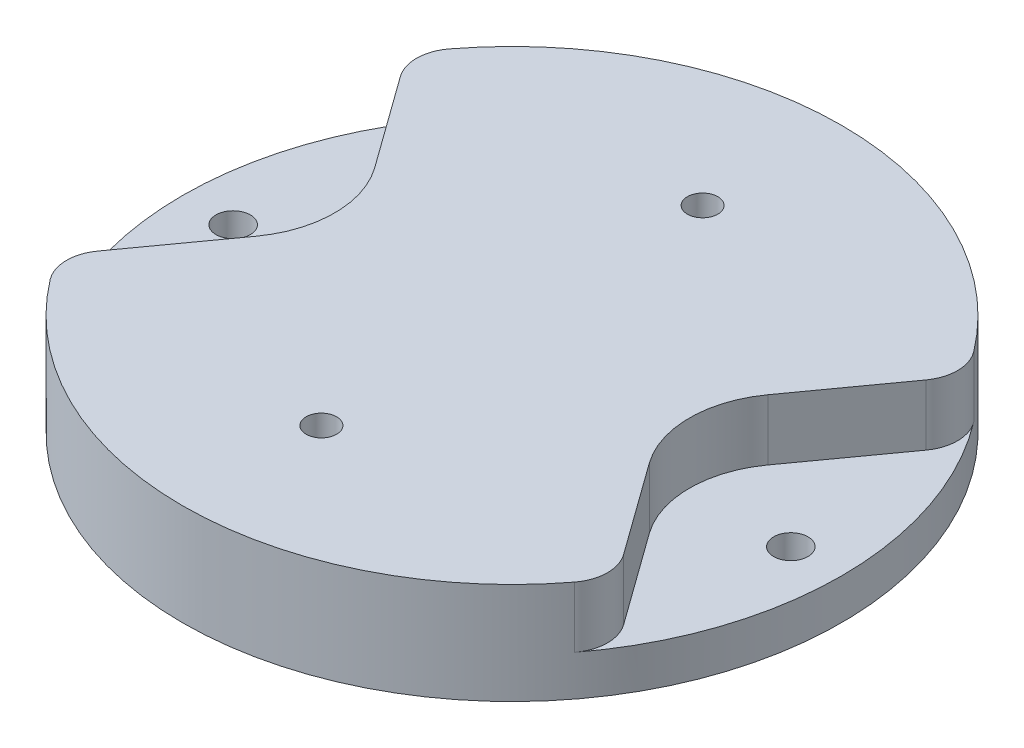
ISO-10303-21;
HEADER;
FILE_DESCRIPTION(('STEP AP214'),'2;1');
FILE_NAME('part.step','',(''),(''),'','','');
FILE_SCHEMA(('AUTOMOTIVE_DESIGN { 1 0 10303 214 1 1 1 1 }'));
ENDSEC;
DATA;
#1=APPLICATION_CONTEXT('core data for automotive mechanical design processes');
#2=APPLICATION_PROTOCOL_DEFINITION('international standard','automotive_design',2000,#1);
#3=PRODUCT_CONTEXT('',#1,'mechanical');
#4=PRODUCT('Part','Part','',(#3));
#5=PRODUCT_RELATED_PRODUCT_CATEGORY('part','',(#4));
#6=PRODUCT_DEFINITION_FORMATION('','',#4);
#7=PRODUCT_DEFINITION_CONTEXT('part definition',#1,'design');
#8=PRODUCT_DEFINITION('design','',#6,#7);
#9=PRODUCT_DEFINITION_SHAPE('','',#8);
#10=(LENGTH_UNIT() NAMED_UNIT(*) SI_UNIT(.MILLI.,.METRE.));
#11=(NAMED_UNIT(*) PLANE_ANGLE_UNIT() SI_UNIT($,.RADIAN.));
#12=(NAMED_UNIT(*) SI_UNIT($,.STERADIAN.) SOLID_ANGLE_UNIT());
#13=UNCERTAINTY_MEASURE_WITH_UNIT(LENGTH_MEASURE(1.E-05),#10,'distance_accuracy_value','');
#14=(GEOMETRIC_REPRESENTATION_CONTEXT(3) GLOBAL_UNCERTAINTY_ASSIGNED_CONTEXT((#13)) GLOBAL_UNIT_ASSIGNED_CONTEXT((#10,
#11,#12)) REPRESENTATION_CONTEXT('',''));
#15=CARTESIAN_POINT('',(0.,0.,0.));
#16=DIRECTION('',(0.,0.,1.));
#17=DIRECTION('',(1.,0.,0.));
#18=AXIS2_PLACEMENT_3D('',#15,#16,#17);
#19=CARTESIAN_POINT('',(0.,12.7,0.));
#20=DIRECTION('',(0.,-1.,0.));
#21=DIRECTION('',(0.,0.,-1.));
#22=AXIS2_PLACEMENT_3D('',#19,#20,#21);
#23=CYLINDRICAL_SURFACE('',#22,41.275);
#24=CARTESIAN_POINT('',(0.,0.,0.));
#25=DIRECTION('',(0.,1.,0.));
#26=DIRECTION('',(0.,0.,1.));
#27=AXIS2_PLACEMENT_3D('',#24,#25,#26);
#28=CIRCLE('',#27,41.275);
#29=CARTESIAN_POINT('',(0.,0.,41.275));
#30=VERTEX_POINT('',#29);
#31=EDGE_CURVE('E282',#30,#30,#28,.T.);
#32=ORIENTED_EDGE('',*,*,#31,.T.);
#33=EDGE_LOOP('',(#32));
#34=FACE_BOUND('',#33,.T.);
#35=CARTESIAN_POINT('',(0.,5.08,0.));
#36=DIRECTION('',(0.,1.,0.));
#37=DIRECTION('',(0.,0.,1.));
#38=AXIS2_PLACEMENT_3D('',#35,#36,#37);
#39=CIRCLE('',#38,41.275);
#40=CARTESIAN_POINT('',(32.8472122737896,5.08,24.9937246292066));
#41=VERTEX_POINT('',#40);
#42=CARTESIAN_POINT('',(32.8472122737896,5.08,-24.9937246292066));
#43=VERTEX_POINT('',#42);
#44=EDGE_CURVE('E202',#41,#43,#39,.T.);
#45=ORIENTED_EDGE('',*,*,#44,.F.);
#46=DIRECTION('',(0.,-1.,0.));
#47=VECTOR('',#46,1.);
#48=CARTESIAN_POINT('',(32.8472122737896,12.7,24.9937246292066));
#49=LINE('',#48,#47);
#50=CARTESIAN_POINT('',(32.8472122737896,12.7,24.9937246292066));
#51=VERTEX_POINT('',#50);
#52=EDGE_CURVE('E328',#41,#51,#49,.F.);
#53=ORIENTED_EDGE('',*,*,#52,.T.);
#54=CARTESIAN_POINT('',(0.,12.7,0.));
#55=DIRECTION('',(0.,1.,0.));
#56=DIRECTION('',(0.,0.,1.));
#57=AXIS2_PLACEMENT_3D('',#54,#55,#56);
#58=CIRCLE('',#57,41.275);
#59=CARTESIAN_POINT('',(-32.8472122737896,12.7,24.9937246292066));
#60=VERTEX_POINT('',#59);
#61=EDGE_CURVE('E301',#60,#51,#58,.T.);
#62=ORIENTED_EDGE('',*,*,#61,.F.);
#63=DIRECTION('',(0.,-1.,0.));
#64=VECTOR('',#63,1.);
#65=CARTESIAN_POINT('',(-32.8472122737896,12.7,24.9937246292066));
#66=LINE('',#65,#64);
#67=CARTESIAN_POINT('',(-32.8472122737896,5.08,24.9937246292066));
#68=VERTEX_POINT('',#67);
#69=EDGE_CURVE('E320',#60,#68,#66,.T.);
#70=ORIENTED_EDGE('',*,*,#69,.T.);
#71=CARTESIAN_POINT('',(0.,5.08,0.));
#72=DIRECTION('',(0.,1.,0.));
#73=DIRECTION('',(0.,0.,1.));
#74=AXIS2_PLACEMENT_3D('',#71,#72,#73);
#75=CIRCLE('',#74,41.275);
#76=CARTESIAN_POINT('',(-32.8472122737896,5.08,-24.9937246292066));
#77=VERTEX_POINT('',#76);
#78=EDGE_CURVE('E252',#77,#68,#75,.T.);
#79=ORIENTED_EDGE('',*,*,#78,.F.);
#80=DIRECTION('',(0.,-1.,0.));
#81=VECTOR('',#80,1.);
#82=CARTESIAN_POINT('',(-32.8472122737896,12.7,-24.9937246292066));
#83=LINE('',#82,#81);
#84=CARTESIAN_POINT('',(-32.8472122737896,12.7,-24.9937246292066));
#85=VERTEX_POINT('',#84);
#86=EDGE_CURVE('E300',#77,#85,#83,.F.);
#87=ORIENTED_EDGE('',*,*,#86,.T.);
#88=CARTESIAN_POINT('',(32.8472122737896,12.7,-24.9937246292066));
#89=VERTEX_POINT('',#88);
#90=EDGE_CURVE('E296',#89,#85,#58,.T.);
#91=ORIENTED_EDGE('',*,*,#90,.F.);
#92=DIRECTION('',(0.,-1.,0.));
#93=VECTOR('',#92,1.);
#94=CARTESIAN_POINT('',(32.8472122737896,12.7,-24.9937246292066));
#95=LINE('',#94,#93);
#96=EDGE_CURVE('E324',#89,#43,#95,.T.);
#97=ORIENTED_EDGE('',*,*,#96,.T.);
#98=EDGE_LOOP('',(#45,#53,#62,#70,#79,#87,#91,#97));
#99=FACE_BOUND('',#98,.T.);
#100=ADVANCED_FACE('F99',(#34,#99),#23,.T.);
#101=CARTESIAN_POINT('',(-34.925,12.7,0.));
#102=DIRECTION('',(0.,-1.,0.));
#103=DIRECTION('',(0.,0.,-1.));
#104=AXIS2_PLACEMENT_3D('',#101,#102,#103);
#105=CYLINDRICAL_SURFACE('',#104,2.15);
#106=CARTESIAN_POINT('',(-34.925,0.,0.));
#107=DIRECTION('',(0.,1.,0.));
#108=DIRECTION('',(0.,0.,1.));
#109=AXIS2_PLACEMENT_3D('',#106,#107,#108);
#110=CIRCLE('',#109,2.15);
#111=CARTESIAN_POINT('',(-34.925,0.,2.15));
#112=VERTEX_POINT('',#111);
#113=EDGE_CURVE('E291',#112,#112,#110,.T.);
#114=ORIENTED_EDGE('',*,*,#113,.F.);
#115=EDGE_LOOP('',(#114));
#116=FACE_BOUND('',#115,.T.);
#117=CARTESIAN_POINT('',(-34.925,5.08,0.));
#118=DIRECTION('',(0.,1.,0.));
#119=DIRECTION('',(0.,0.,1.));
#120=AXIS2_PLACEMENT_3D('',#117,#118,#119);
#121=CIRCLE('',#120,2.15);
#122=CARTESIAN_POINT('',(-34.925,5.08,2.15));
#123=VERTEX_POINT('',#122);
#124=EDGE_CURVE('E277',#123,#123,#121,.T.);
#125=ORIENTED_EDGE('',*,*,#124,.T.);
#126=EDGE_LOOP('',(#125));
#127=FACE_BOUND('',#126,.T.);
#128=ADVANCED_FACE('F414',(#116,#127),#105,.F.);
#129=CARTESIAN_POINT('',(34.925,12.7,0.));
#130=DIRECTION('',(0.,-1.,0.));
#131=DIRECTION('',(0.,0.,-1.));
#132=AXIS2_PLACEMENT_3D('',#129,#130,#131);
#133=CYLINDRICAL_SURFACE('',#132,2.15);
#134=CARTESIAN_POINT('',(34.925,0.,0.));
#135=DIRECTION('',(0.,1.,0.));
#136=DIRECTION('',(0.,0.,1.));
#137=AXIS2_PLACEMENT_3D('',#134,#135,#136);
#138=CIRCLE('',#137,2.15);
#139=CARTESIAN_POINT('',(34.925,0.,2.14999999999999));
#140=VERTEX_POINT('',#139);
#141=EDGE_CURVE('E283',#140,#140,#138,.T.);
#142=ORIENTED_EDGE('',*,*,#141,.F.);
#143=EDGE_LOOP('',(#142));
#144=FACE_BOUND('',#143,.T.);
#145=CARTESIAN_POINT('',(34.925,5.08,0.));
#146=DIRECTION('',(0.,1.,0.));
#147=DIRECTION('',(0.,0.,1.));
#148=AXIS2_PLACEMENT_3D('',#145,#146,#147);
#149=CIRCLE('',#148,2.15);
#150=CARTESIAN_POINT('',(34.925,5.08,2.14999999999999));
#151=VERTEX_POINT('',#150);
#152=EDGE_CURVE('E213',#151,#151,#149,.T.);
#153=ORIENTED_EDGE('',*,*,#152,.T.);
#154=EDGE_LOOP('',(#153));
#155=FACE_BOUND('',#154,.T.);
#156=ADVANCED_FACE('F420',(#144,#155),#133,.F.);
#157=CARTESIAN_POINT('',(0.,12.7,0.));
#158=DIRECTION('',(0.,1.,0.));
#159=DIRECTION('',(0.,0.,1.));
#160=AXIS2_PLACEMENT_3D('',#157,#158,#159);
#161=PLANE('',#160);
#162=ORIENTED_EDGE('',*,*,#61,.T.);
#163=CARTESIAN_POINT('',(28.804478455477,12.7,21.9175739056119));
#164=DIRECTION('',(0.,1.,0.));
#165=DIRECTION('',(0.,0.,1.));
#166=AXIS2_PLACEMENT_3D('',#163,#164,#165);
#167=CIRCLE('',#166,5.08);
#168=CARTESIAN_POINT('',(32.9257259832032,12.7,18.9474360611322));
#169=VERTEX_POINT('',#168);
#170=EDGE_CURVE('E341',#51,#169,#167,.T.);
#171=ORIENTED_EDGE('',*,*,#170,.T.);
#172=DIRECTION('',(-0.584672804031446,0.,-0.811269198371297));
#173=VECTOR('',#172,1.);
#174=CARTESIAN_POINT('',(12.6830392801778,12.7,-9.14052715728607));
#175=LINE('',#174,#173);
#176=CARTESIAN_POINT('',(24.6218811806846,12.7,7.42534461119937));
#177=VERTEX_POINT('',#176);
#178=EDGE_CURVE('E219',#169,#177,#175,.T.);
#179=ORIENTED_EDGE('',*,*,#178,.T.);
#180=CARTESIAN_POINT('',(34.925,12.7,0.));
#181=DIRECTION('',(0.,1.,0.));
#182=DIRECTION('',(0.,0.,1.));
#183=AXIS2_PLACEMENT_3D('',#180,#181,#182);
#184=CIRCLE('',#183,12.7);
#185=CARTESIAN_POINT('',(24.6218811806845,12.7,-7.42534461119939));
#186=VERTEX_POINT('',#185);
#187=EDGE_CURVE('E220',#186,#177,#184,.T.);
#188=ORIENTED_EDGE('',*,*,#187,.F.);
#189=DIRECTION('',(-0.584672804031447,0.,0.811269198371296));
#190=VECTOR('',#189,1.);
#191=CARTESIAN_POINT('',(12.6830392801778,12.7,9.14052715728607));
#192=LINE('',#191,#190);
#193=CARTESIAN_POINT('',(32.9257259832032,12.7,-18.9474360611322));
#194=VERTEX_POINT('',#193);
#195=EDGE_CURVE('E203',#194,#186,#192,.T.);
#196=ORIENTED_EDGE('',*,*,#195,.F.);
#197=CARTESIAN_POINT('',(28.804478455477,12.7,-21.9175739056119));
#198=DIRECTION('',(0.,1.,0.));
#199=DIRECTION('',(0.,0.,1.));
#200=AXIS2_PLACEMENT_3D('',#197,#198,#199);
#201=CIRCLE('',#200,5.08);
#202=EDGE_CURVE('E338',#194,#89,#201,.T.);
#203=ORIENTED_EDGE('',*,*,#202,.T.);
#204=ORIENTED_EDGE('',*,*,#90,.T.);
#205=CARTESIAN_POINT('',(-28.804478455477,12.7,-21.9175739056119));
#206=DIRECTION('',(0.,1.,0.));
#207=DIRECTION('',(0.,0.,1.));
#208=AXIS2_PLACEMENT_3D('',#205,#206,#207);
#209=CIRCLE('',#208,5.08);
#210=CARTESIAN_POINT('',(-32.9257259832032,12.7,-18.9474360611322));
#211=VERTEX_POINT('',#210);
#212=EDGE_CURVE('E332',#85,#211,#209,.T.);
#213=ORIENTED_EDGE('',*,*,#212,.T.);
#214=DIRECTION('',(0.584672804031447,0.,0.811269198371296));
#215=VECTOR('',#214,1.);
#216=CARTESIAN_POINT('',(-12.6830392801778,12.7,9.14052715728606));
#217=LINE('',#216,#215);
#218=CARTESIAN_POINT('',(-24.6218811806845,12.7,-7.42534461119938));
#219=VERTEX_POINT('',#218);
#220=EDGE_CURVE('E237',#211,#219,#217,.T.);
#221=ORIENTED_EDGE('',*,*,#220,.T.);
#222=CARTESIAN_POINT('',(-34.925,12.7,0.));
#223=DIRECTION('',(0.,1.,0.));
#224=DIRECTION('',(0.,0.,1.));
#225=AXIS2_PLACEMENT_3D('',#222,#223,#224);
#226=CIRCLE('',#225,12.7);
#227=CARTESIAN_POINT('',(-24.6218811806845,12.7,7.42534461119936));
#228=VERTEX_POINT('',#227);
#229=EDGE_CURVE('E226',#228,#219,#226,.T.);
#230=ORIENTED_EDGE('',*,*,#229,.F.);
#231=DIRECTION('',(0.584672804031446,0.,-0.811269198371297));
#232=VECTOR('',#231,1.);
#233=CARTESIAN_POINT('',(-12.6830392801778,12.7,-9.14052715728606));
#234=LINE('',#233,#232);
#235=CARTESIAN_POINT('',(-32.9257259832032,12.7,18.9474360611322));
#236=VERTEX_POINT('',#235);
#237=EDGE_CURVE('E243',#236,#228,#234,.T.);
#238=ORIENTED_EDGE('',*,*,#237,.F.);
#239=CARTESIAN_POINT('',(-28.804478455477,12.7,21.9175739056119));
#240=DIRECTION('',(0.,1.,0.));
#241=DIRECTION('',(0.,0.,1.));
#242=AXIS2_PLACEMENT_3D('',#239,#240,#241);
#243=CIRCLE('',#242,5.08);
#244=EDGE_CURVE('E335',#236,#60,#243,.T.);
#245=ORIENTED_EDGE('',*,*,#244,.T.);
#246=EDGE_LOOP('',(#162,#171,#179,#188,#196,#203,#204,#213,#221,#230,#238,#245));
#247=FACE_BOUND('',#246,.T.);
#248=CARTESIAN_POINT('',(0.,12.7,-23.876));
#249=DIRECTION('',(0.,1.,0.));
#250=DIRECTION('',(0.,0.,1.));
#251=AXIS2_PLACEMENT_3D('',#248,#249,#250);
#252=CIRCLE('',#251,1.905);
#253=CARTESIAN_POINT('',(0.,12.7,-21.971));
#254=VERTEX_POINT('',#253);
#255=EDGE_CURVE('E278',#254,#254,#252,.T.);
#256=ORIENTED_EDGE('',*,*,#255,.F.);
#257=EDGE_LOOP('',(#256));
#258=FACE_BOUND('',#257,.T.);
#259=CARTESIAN_POINT('',(0.,12.7,23.876));
#260=DIRECTION('',(0.,1.,0.));
#261=DIRECTION('',(0.,0.,1.));
#262=AXIS2_PLACEMENT_3D('',#259,#260,#261);
#263=CIRCLE('',#262,1.905);
#264=CARTESIAN_POINT('',(0.,12.7,25.781));
#265=VERTEX_POINT('',#264);
#266=EDGE_CURVE('E287',#265,#265,#263,.T.);
#267=ORIENTED_EDGE('',*,*,#266,.F.);
#268=EDGE_LOOP('',(#267));
#269=FACE_BOUND('',#268,.T.);
#270=ADVANCED_FACE('F383',(#247,#258,#269),#161,.T.);
#271=CARTESIAN_POINT('',(0.,0.,0.));
#272=DIRECTION('',(0.,1.,0.));
#273=DIRECTION('',(0.,0.,1.));
#274=AXIS2_PLACEMENT_3D('',#271,#272,#273);
#275=PLANE('',#274);
#276=CARTESIAN_POINT('',(0.,0.,-23.876));
#277=DIRECTION('',(0.,1.,0.));
#278=DIRECTION('',(0.,0.,1.));
#279=AXIS2_PLACEMENT_3D('',#276,#277,#278);
#280=CIRCLE('',#279,7.62);
#281=CARTESIAN_POINT('',(0.,0.,-16.256));
#282=VERTEX_POINT('',#281);
#283=EDGE_CURVE('E265',#282,#282,#280,.T.);
#284=ORIENTED_EDGE('',*,*,#283,.T.);
#285=EDGE_LOOP('',(#284));
#286=FACE_BOUND('',#285,.T.);
#287=CARTESIAN_POINT('',(0.,0.,23.876));
#288=DIRECTION('',(0.,1.,0.));
#289=DIRECTION('',(0.,0.,1.));
#290=AXIS2_PLACEMENT_3D('',#287,#288,#289);
#291=CIRCLE('',#290,7.62);
#292=CARTESIAN_POINT('',(0.,0.,31.496));
#293=VERTEX_POINT('',#292);
#294=EDGE_CURVE('E269',#293,#293,#291,.T.);
#295=ORIENTED_EDGE('',*,*,#294,.T.);
#296=EDGE_LOOP('',(#295));
#297=FACE_BOUND('',#296,.T.);
#298=ORIENTED_EDGE('',*,*,#141,.T.);
#299=EDGE_LOOP('',(#298));
#300=FACE_BOUND('',#299,.T.);
#301=ORIENTED_EDGE('',*,*,#113,.T.);
#302=EDGE_LOOP('',(#301));
#303=FACE_BOUND('',#302,.T.);
#304=ORIENTED_EDGE('',*,*,#31,.F.);
#305=EDGE_LOOP('',(#304));
#306=FACE_BOUND('',#305,.T.);
#307=ADVANCED_FACE('F424',(#286,#297,#300,#303,#306),#275,.F.);
#308=CARTESIAN_POINT('',(0.,12.7,23.876));
#309=DIRECTION('',(0.,-1.,0.));
#310=DIRECTION('',(0.,0.,-1.));
#311=AXIS2_PLACEMENT_3D('',#308,#309,#310);
#312=CYLINDRICAL_SURFACE('',#311,1.905);
#313=CARTESIAN_POINT('',(0.,5.08,23.876));
#314=DIRECTION('',(0.,1.,0.));
#315=DIRECTION('',(0.,0.,1.));
#316=AXIS2_PLACEMENT_3D('',#313,#314,#315);
#317=CIRCLE('',#316,1.905);
#318=CARTESIAN_POINT('',(0.,5.08,25.781));
#319=VERTEX_POINT('',#318);
#320=EDGE_CURVE('E295',#319,#319,#317,.T.);
#321=ORIENTED_EDGE('',*,*,#320,.F.);
#322=EDGE_LOOP('',(#321));
#323=FACE_BOUND('',#322,.T.);
#324=ORIENTED_EDGE('',*,*,#266,.T.);
#325=EDGE_LOOP('',(#324));
#326=FACE_BOUND('',#325,.T.);
#327=ADVANCED_FACE('F427',(#323,#326),#312,.F.);
#328=CARTESIAN_POINT('',(0.,12.7,-23.876));
#329=DIRECTION('',(0.,-1.,0.));
#330=DIRECTION('',(0.,0.,-1.));
#331=AXIS2_PLACEMENT_3D('',#328,#329,#330);
#332=CYLINDRICAL_SURFACE('',#331,1.905);
#333=CARTESIAN_POINT('',(0.,5.08,-23.876));
#334=DIRECTION('',(0.,1.,0.));
#335=DIRECTION('',(0.,0.,1.));
#336=AXIS2_PLACEMENT_3D('',#333,#334,#335);
#337=CIRCLE('',#336,1.905);
#338=CARTESIAN_POINT('',(0.,5.08,-21.971));
#339=VERTEX_POINT('',#338);
#340=EDGE_CURVE('E264',#339,#339,#337,.T.);
#341=ORIENTED_EDGE('',*,*,#340,.F.);
#342=EDGE_LOOP('',(#341));
#343=FACE_BOUND('',#342,.T.);
#344=ORIENTED_EDGE('',*,*,#255,.T.);
#345=EDGE_LOOP('',(#344));
#346=FACE_BOUND('',#345,.T.);
#347=ADVANCED_FACE('F433',(#343,#346),#332,.F.);
#348=CARTESIAN_POINT('',(0.,5.08,-23.876));
#349=DIRECTION('',(0.,-1.,0.));
#350=DIRECTION('',(0.,0.,-1.));
#351=AXIS2_PLACEMENT_3D('',#348,#349,#350);
#352=CYLINDRICAL_SURFACE('',#351,7.62);
#353=CARTESIAN_POINT('',(0.,5.08,-23.876));
#354=DIRECTION('',(0.,1.,0.));
#355=DIRECTION('',(0.,0.,1.));
#356=AXIS2_PLACEMENT_3D('',#353,#354,#355);
#357=CIRCLE('',#356,7.62);
#358=CARTESIAN_POINT('',(0.,5.08,-16.256));
#359=VERTEX_POINT('',#358);
#360=EDGE_CURVE('E260',#359,#359,#357,.T.);
#361=ORIENTED_EDGE('',*,*,#360,.T.);
#362=EDGE_LOOP('',(#361));
#363=FACE_BOUND('',#362,.T.);
#364=ORIENTED_EDGE('',*,*,#283,.F.);
#365=EDGE_LOOP('',(#364));
#366=FACE_BOUND('',#365,.T.);
#367=ADVANCED_FACE('F440',(#363,#366),#352,.F.);
#368=CARTESIAN_POINT('',(0.,5.08,0.));
#369=DIRECTION('',(0.,1.,0.));
#370=DIRECTION('',(0.,0.,1.));
#371=AXIS2_PLACEMENT_3D('',#368,#369,#370);
#372=PLANE('',#371);
#373=ORIENTED_EDGE('',*,*,#340,.T.);
#374=EDGE_LOOP('',(#373));
#375=FACE_BOUND('',#374,.T.);
#376=ORIENTED_EDGE('',*,*,#360,.F.);
#377=EDGE_LOOP('',(#376));
#378=FACE_BOUND('',#377,.T.);
#379=ADVANCED_FACE('F449',(#375,#378),#372,.F.);
#380=CARTESIAN_POINT('',(0.,5.08,23.876));
#381=DIRECTION('',(0.,-1.,0.));
#382=DIRECTION('',(0.,0.,-1.));
#383=AXIS2_PLACEMENT_3D('',#380,#381,#382);
#384=CYLINDRICAL_SURFACE('',#383,7.62);
#385=CARTESIAN_POINT('',(0.,5.08,23.876));
#386=DIRECTION('',(0.,1.,0.));
#387=DIRECTION('',(0.,0.,1.));
#388=AXIS2_PLACEMENT_3D('',#385,#386,#387);
#389=CIRCLE('',#388,7.62);
#390=CARTESIAN_POINT('',(0.,5.08,31.496));
#391=VERTEX_POINT('',#390);
#392=EDGE_CURVE('E273',#391,#391,#389,.T.);
#393=ORIENTED_EDGE('',*,*,#392,.T.);
#394=EDGE_LOOP('',(#393));
#395=FACE_BOUND('',#394,.T.);
#396=ORIENTED_EDGE('',*,*,#294,.F.);
#397=EDGE_LOOP('',(#396));
#398=FACE_BOUND('',#397,.T.);
#399=ADVANCED_FACE('F445',(#395,#398),#384,.F.);
#400=CARTESIAN_POINT('',(0.,5.08,0.));
#401=DIRECTION('',(0.,1.,0.));
#402=DIRECTION('',(0.,0.,1.));
#403=AXIS2_PLACEMENT_3D('',#400,#401,#402);
#404=PLANE('',#403);
#405=ORIENTED_EDGE('',*,*,#320,.T.);
#406=EDGE_LOOP('',(#405));
#407=FACE_BOUND('',#406,.T.);
#408=ORIENTED_EDGE('',*,*,#392,.F.);
#409=EDGE_LOOP('',(#408));
#410=FACE_BOUND('',#409,.T.);
#411=ADVANCED_FACE('F442',(#407,#410),#404,.F.);
#412=CARTESIAN_POINT('',(34.925,5.08,0.));
#413=DIRECTION('',(0.,1.,0.));
#414=DIRECTION('',(0.,0.,1.));
#415=AXIS2_PLACEMENT_3D('',#412,#413,#414);
#416=PLANE('',#415);
#417=ORIENTED_EDGE('',*,*,#152,.F.);
#418=EDGE_LOOP('',(#417));
#419=FACE_BOUND('',#418,.T.);
#420=DIRECTION('',(-0.584672804031446,0.,-0.811269198371297));
#421=VECTOR('',#420,1.);
#422=CARTESIAN_POINT('',(12.6830392801778,5.08,-9.14052715728607));
#423=LINE('',#422,#421);
#424=CARTESIAN_POINT('',(32.9257259832032,5.08,18.9474360611322));
#425=VERTEX_POINT('',#424);
#426=CARTESIAN_POINT('',(24.6218811806846,5.08,7.42534461119937));
#427=VERTEX_POINT('',#426);
#428=EDGE_CURVE('E224',#425,#427,#423,.T.);
#429=ORIENTED_EDGE('',*,*,#428,.F.);
#430=CARTESIAN_POINT('',(28.804478455477,5.08,21.9175739056119));
#431=DIRECTION('',(0.,1.,0.));
#432=DIRECTION('',(0.,0.,1.));
#433=AXIS2_PLACEMENT_3D('',#430,#431,#432);
#434=CIRCLE('',#433,5.08);
#435=EDGE_CURVE('E356',#425,#41,#434,.F.);
#436=ORIENTED_EDGE('',*,*,#435,.T.);
#437=ORIENTED_EDGE('',*,*,#44,.T.);
#438=CARTESIAN_POINT('',(28.804478455477,5.08,-21.9175739056119));
#439=DIRECTION('',(0.,1.,0.));
#440=DIRECTION('',(0.,0.,1.));
#441=AXIS2_PLACEMENT_3D('',#438,#439,#440);
#442=CIRCLE('',#441,5.08);
#443=CARTESIAN_POINT('',(32.9257259832032,5.08,-18.9474360611322));
#444=VERTEX_POINT('',#443);
#445=EDGE_CURVE('E197',#43,#444,#442,.F.);
#446=ORIENTED_EDGE('',*,*,#445,.T.);
#447=DIRECTION('',(-0.584672804031447,0.,0.811269198371296));
#448=VECTOR('',#447,1.);
#449=CARTESIAN_POINT('',(12.6830392801778,5.08,9.14052715728607));
#450=LINE('',#449,#448);
#451=CARTESIAN_POINT('',(24.6218811806846,5.08,-7.42534461119937));
#452=VERTEX_POINT('',#451);
#453=EDGE_CURVE('E189',#444,#452,#450,.T.);
#454=ORIENTED_EDGE('',*,*,#453,.T.);
#455=CARTESIAN_POINT('',(34.925,5.08,0.));
#456=DIRECTION('',(0.,1.,0.));
#457=DIRECTION('',(0.,0.,1.));
#458=AXIS2_PLACEMENT_3D('',#455,#456,#457);
#459=CIRCLE('',#458,12.7);
#460=EDGE_CURVE('E194',#452,#427,#459,.T.);
#461=ORIENTED_EDGE('',*,*,#460,.T.);
#462=EDGE_LOOP('',(#429,#436,#437,#446,#454,#461));
#463=FACE_BOUND('',#462,.T.);
#464=ADVANCED_FACE('F192',(#419,#463),#416,.T.);
#465=CARTESIAN_POINT('',(12.6830392801778,5.08,9.14052715728607));
#466=DIRECTION('',(-0.811269198371296,0.,-0.584672804031446));
#467=DIRECTION('',(-0.584672804031446,0.,0.811269198371296));
#468=AXIS2_PLACEMENT_3D('',#465,#466,#467);
#469=PLANE('',#468);
#470=ORIENTED_EDGE('',*,*,#453,.F.);
#471=DIRECTION('',(0.,-1.,0.));
#472=VECTOR('',#471,1.);
#473=CARTESIAN_POINT('',(32.9257259832032,5.08,-18.9474360611322));
#474=LINE('',#473,#472);
#475=EDGE_CURVE('E347',#444,#194,#474,.F.);
#476=ORIENTED_EDGE('',*,*,#475,.T.);
#477=ORIENTED_EDGE('',*,*,#195,.T.);
#478=DIRECTION('',(0.,1.,0.));
#479=VECTOR('',#478,1.);
#480=CARTESIAN_POINT('',(24.6218811806846,5.08,-7.42534461119937));
#481=LINE('',#480,#479);
#482=EDGE_CURVE('E206',#452,#186,#481,.T.);
#483=ORIENTED_EDGE('',*,*,#482,.F.);
#484=EDGE_LOOP('',(#470,#476,#477,#483));
#485=FACE_BOUND('',#484,.T.);
#486=ADVANCED_FACE('F207',(#485),#469,.F.);
#487=CARTESIAN_POINT('',(12.6830392801778,5.08,-9.14052715728607));
#488=DIRECTION('',(0.811269198371297,0.,-0.584672804031446));
#489=DIRECTION('',(-0.584672804031446,0.,-0.811269198371297));
#490=AXIS2_PLACEMENT_3D('',#487,#488,#489);
#491=PLANE('',#490);
#492=ORIENTED_EDGE('',*,*,#178,.F.);
#493=DIRECTION('',(0.,1.,0.));
#494=VECTOR('',#493,1.);
#495=CARTESIAN_POINT('',(32.9257259832032,5.08,18.9474360611322));
#496=LINE('',#495,#494);
#497=EDGE_CURVE('E344',#169,#425,#496,.F.);
#498=ORIENTED_EDGE('',*,*,#497,.T.);
#499=ORIENTED_EDGE('',*,*,#428,.T.);
#500=DIRECTION('',(0.,1.,0.));
#501=VECTOR('',#500,1.);
#502=CARTESIAN_POINT('',(24.6218811806846,5.08,7.42534461119937));
#503=LINE('',#502,#501);
#504=EDGE_CURVE('E217',#427,#177,#503,.T.);
#505=ORIENTED_EDGE('',*,*,#504,.T.);
#506=EDGE_LOOP('',(#492,#498,#499,#505));
#507=FACE_BOUND('',#506,.T.);
#508=ADVANCED_FACE('F373',(#507),#491,.T.);
#509=CARTESIAN_POINT('',(34.925,5.08,0.));
#510=DIRECTION('',(0.,1.,0.));
#511=DIRECTION('',(0.,0.,1.));
#512=AXIS2_PLACEMENT_3D('',#509,#510,#511);
#513=CYLINDRICAL_SURFACE('',#512,12.7);
#514=ORIENTED_EDGE('',*,*,#482,.T.);
#515=ORIENTED_EDGE('',*,*,#187,.T.);
#516=ORIENTED_EDGE('',*,*,#504,.F.);
#517=ORIENTED_EDGE('',*,*,#460,.F.);
#518=EDGE_LOOP('',(#514,#515,#516,#517));
#519=FACE_BOUND('',#518,.T.);
#520=ADVANCED_FACE('F215',(#519),#513,.F.);
#521=CARTESIAN_POINT('',(-34.925,5.08,0.));
#522=DIRECTION('',(0.,1.,0.));
#523=DIRECTION('',(0.,0.,1.));
#524=AXIS2_PLACEMENT_3D('',#521,#522,#523);
#525=PLANE('',#524);
#526=ORIENTED_EDGE('',*,*,#124,.F.);
#527=EDGE_LOOP('',(#526));
#528=FACE_BOUND('',#527,.T.);
#529=DIRECTION('',(0.584672804031447,0.,0.811269198371296));
#530=VECTOR('',#529,1.);
#531=CARTESIAN_POINT('',(-12.6830392801778,5.08,9.14052715728606));
#532=LINE('',#531,#530);
#533=CARTESIAN_POINT('',(-32.9257259832032,5.08,-18.9474360611322));
#534=VERTEX_POINT('',#533);
#535=CARTESIAN_POINT('',(-24.6218811806845,5.08,-7.42534461119938));
#536=VERTEX_POINT('',#535);
#537=EDGE_CURVE('E242',#534,#536,#532,.T.);
#538=ORIENTED_EDGE('',*,*,#537,.F.);
#539=CARTESIAN_POINT('',(-28.804478455477,5.08,-21.9175739056119));
#540=DIRECTION('',(0.,1.,0.));
#541=DIRECTION('',(0.,0.,1.));
#542=AXIS2_PLACEMENT_3D('',#539,#540,#541);
#543=CIRCLE('',#542,5.08);
#544=EDGE_CURVE('E12',#534,#77,#543,.F.);
#545=ORIENTED_EDGE('',*,*,#544,.T.);
#546=ORIENTED_EDGE('',*,*,#78,.T.);
#547=CARTESIAN_POINT('',(-28.804478455477,5.08,21.9175739056119));
#548=DIRECTION('',(0.,1.,0.));
#549=DIRECTION('',(0.,0.,1.));
#550=AXIS2_PLACEMENT_3D('',#547,#548,#549);
#551=CIRCLE('',#550,5.08);
#552=CARTESIAN_POINT('',(-32.9257259832032,5.08,18.9474360611322));
#553=VERTEX_POINT('',#552);
#554=EDGE_CURVE('E108',#68,#553,#551,.F.);
#555=ORIENTED_EDGE('',*,*,#554,.T.);
#556=DIRECTION('',(0.584672804031446,0.,-0.811269198371297));
#557=VECTOR('',#556,1.);
#558=CARTESIAN_POINT('',(-12.6830392801778,5.08,-9.14052715728606));
#559=LINE('',#558,#557);
#560=CARTESIAN_POINT('',(-24.6218811806845,5.08,7.42534461119936));
#561=VERTEX_POINT('',#560);
#562=EDGE_CURVE('E255',#553,#561,#559,.T.);
#563=ORIENTED_EDGE('',*,*,#562,.T.);
#564=CARTESIAN_POINT('',(-34.925,5.08,0.));
#565=DIRECTION('',(0.,1.,0.));
#566=DIRECTION('',(0.,0.,1.));
#567=AXIS2_PLACEMENT_3D('',#564,#565,#566);
#568=CIRCLE('',#567,12.7);
#569=EDGE_CURVE('E233',#561,#536,#568,.T.);
#570=ORIENTED_EDGE('',*,*,#569,.T.);
#571=EDGE_LOOP('',(#538,#545,#546,#555,#563,#570));
#572=FACE_BOUND('',#571,.T.);
#573=ADVANCED_FACE('F394',(#528,#572),#525,.T.);
#574=CARTESIAN_POINT('',(-12.6830392801778,5.08,-9.14052715728606));
#575=DIRECTION('',(0.811269198371297,0.,0.584672804031446));
#576=DIRECTION('',(0.584672804031446,0.,-0.811269198371297));
#577=AXIS2_PLACEMENT_3D('',#574,#575,#576);
#578=PLANE('',#577);
#579=ORIENTED_EDGE('',*,*,#562,.F.);
#580=DIRECTION('',(0.,-1.,0.));
#581=VECTOR('',#580,1.);
#582=CARTESIAN_POINT('',(-32.9257259832032,5.08,18.9474360611322));
#583=LINE('',#582,#581);
#584=EDGE_CURVE('E350',#553,#236,#583,.F.);
#585=ORIENTED_EDGE('',*,*,#584,.T.);
#586=ORIENTED_EDGE('',*,*,#237,.T.);
#587=DIRECTION('',(0.,1.,0.));
#588=VECTOR('',#587,1.);
#589=CARTESIAN_POINT('',(-24.6218811806845,5.08,7.42534461119936));
#590=LINE('',#589,#588);
#591=EDGE_CURVE('E248',#561,#228,#590,.T.);
#592=ORIENTED_EDGE('',*,*,#591,.F.);
#593=EDGE_LOOP('',(#579,#585,#586,#592));
#594=FACE_BOUND('',#593,.T.);
#595=ADVANCED_FACE('F391',(#594),#578,.F.);
#596=CARTESIAN_POINT('',(-12.6830392801778,5.08,9.14052715728606));
#597=DIRECTION('',(-0.811269198371296,0.,0.584672804031446));
#598=DIRECTION('',(0.584672804031446,0.,0.811269198371296));
#599=AXIS2_PLACEMENT_3D('',#596,#597,#598);
#600=PLANE('',#599);
#601=ORIENTED_EDGE('',*,*,#220,.F.);
#602=DIRECTION('',(0.,1.,0.));
#603=VECTOR('',#602,1.);
#604=CARTESIAN_POINT('',(-32.9257259832032,5.08,-18.9474360611322));
#605=LINE('',#604,#603);
#606=EDGE_CURVE('E115',#211,#534,#605,.F.);
#607=ORIENTED_EDGE('',*,*,#606,.T.);
#608=ORIENTED_EDGE('',*,*,#537,.T.);
#609=DIRECTION('',(0.,1.,0.));
#610=VECTOR('',#609,1.);
#611=CARTESIAN_POINT('',(-24.6218811806845,5.08,-7.42534461119938));
#612=LINE('',#611,#610);
#613=EDGE_CURVE('E238',#536,#219,#612,.T.);
#614=ORIENTED_EDGE('',*,*,#613,.T.);
#615=EDGE_LOOP('',(#601,#607,#608,#614));
#616=FACE_BOUND('',#615,.T.);
#617=ADVANCED_FACE('F399',(#616),#600,.T.);
#618=CARTESIAN_POINT('',(-34.925,5.08,0.));
#619=DIRECTION('',(0.,1.,0.));
#620=DIRECTION('',(0.,0.,1.));
#621=AXIS2_PLACEMENT_3D('',#618,#619,#620);
#622=CYLINDRICAL_SURFACE('',#621,12.7);
#623=ORIENTED_EDGE('',*,*,#591,.T.);
#624=ORIENTED_EDGE('',*,*,#229,.T.);
#625=ORIENTED_EDGE('',*,*,#613,.F.);
#626=ORIENTED_EDGE('',*,*,#569,.F.);
#627=EDGE_LOOP('',(#623,#624,#625,#626));
#628=FACE_BOUND('',#627,.T.);
#629=ADVANCED_FACE('F398',(#628),#622,.F.);
#630=CARTESIAN_POINT('',(28.804478455477,12.7,21.9175739056119));
#631=DIRECTION('',(0.,-1.,0.));
#632=DIRECTION('',(0.,0.,-1.));
#633=AXIS2_PLACEMENT_3D('',#630,#631,#632);
#634=CYLINDRICAL_SURFACE('',#633,5.08);
#635=ORIENTED_EDGE('',*,*,#435,.F.);
#636=ORIENTED_EDGE('',*,*,#497,.F.);
#637=ORIENTED_EDGE('',*,*,#170,.F.);
#638=ORIENTED_EDGE('',*,*,#52,.F.);
#639=EDGE_LOOP('',(#635,#636,#637,#638));
#640=FACE_BOUND('',#639,.T.);
#641=ADVANCED_FACE('F378',(#640),#634,.T.);
#642=CARTESIAN_POINT('',(28.804478455477,12.7,-21.9175739056119));
#643=DIRECTION('',(0.,-1.,0.));
#644=DIRECTION('',(0.,0.,-1.));
#645=AXIS2_PLACEMENT_3D('',#642,#643,#644);
#646=CYLINDRICAL_SURFACE('',#645,5.08);
#647=ORIENTED_EDGE('',*,*,#445,.F.);
#648=ORIENTED_EDGE('',*,*,#96,.F.);
#649=ORIENTED_EDGE('',*,*,#202,.F.);
#650=ORIENTED_EDGE('',*,*,#475,.F.);
#651=EDGE_LOOP('',(#647,#648,#649,#650));
#652=FACE_BOUND('',#651,.T.);
#653=ADVANCED_FACE('F405',(#652),#646,.T.);
#654=CARTESIAN_POINT('',(-28.804478455477,12.7,21.9175739056119));
#655=DIRECTION('',(0.,-1.,0.));
#656=DIRECTION('',(0.,0.,-1.));
#657=AXIS2_PLACEMENT_3D('',#654,#655,#656);
#658=CYLINDRICAL_SURFACE('',#657,5.08);
#659=ORIENTED_EDGE('',*,*,#554,.F.);
#660=ORIENTED_EDGE('',*,*,#69,.F.);
#661=ORIENTED_EDGE('',*,*,#244,.F.);
#662=ORIENTED_EDGE('',*,*,#584,.F.);
#663=EDGE_LOOP('',(#659,#660,#661,#662));
#664=FACE_BOUND('',#663,.T.);
#665=ADVANCED_FACE('F389',(#664),#658,.T.);
#666=CARTESIAN_POINT('',(-28.804478455477,12.7,-21.9175739056119));
#667=DIRECTION('',(0.,-1.,0.));
#668=DIRECTION('',(0.,0.,-1.));
#669=AXIS2_PLACEMENT_3D('',#666,#667,#668);
#670=CYLINDRICAL_SURFACE('',#669,5.08);
#671=ORIENTED_EDGE('',*,*,#544,.F.);
#672=ORIENTED_EDGE('',*,*,#606,.F.);
#673=ORIENTED_EDGE('',*,*,#212,.F.);
#674=ORIENTED_EDGE('',*,*,#86,.F.);
#675=EDGE_LOOP('',(#671,#672,#673,#674));
#676=FACE_BOUND('',#675,.T.);
#677=ADVANCED_FACE('F101',(#676),#670,.T.);
#678=CLOSED_SHELL('',(#100,#128,#156,#270,#307,#327,#347,#367,#379,#399,#411,#464,#486,#508,
#520,#573,#595,#617,#629,#641,#653,#665,#677));
#679=MANIFOLD_SOLID_BREP('B2',#678);
#680=ADVANCED_BREP_SHAPE_REPRESENTATION('',(#18,#679),#14);
#681=SHAPE_DEFINITION_REPRESENTATION(#9,#680);
ENDSEC;
END-ISO-10303-21;
